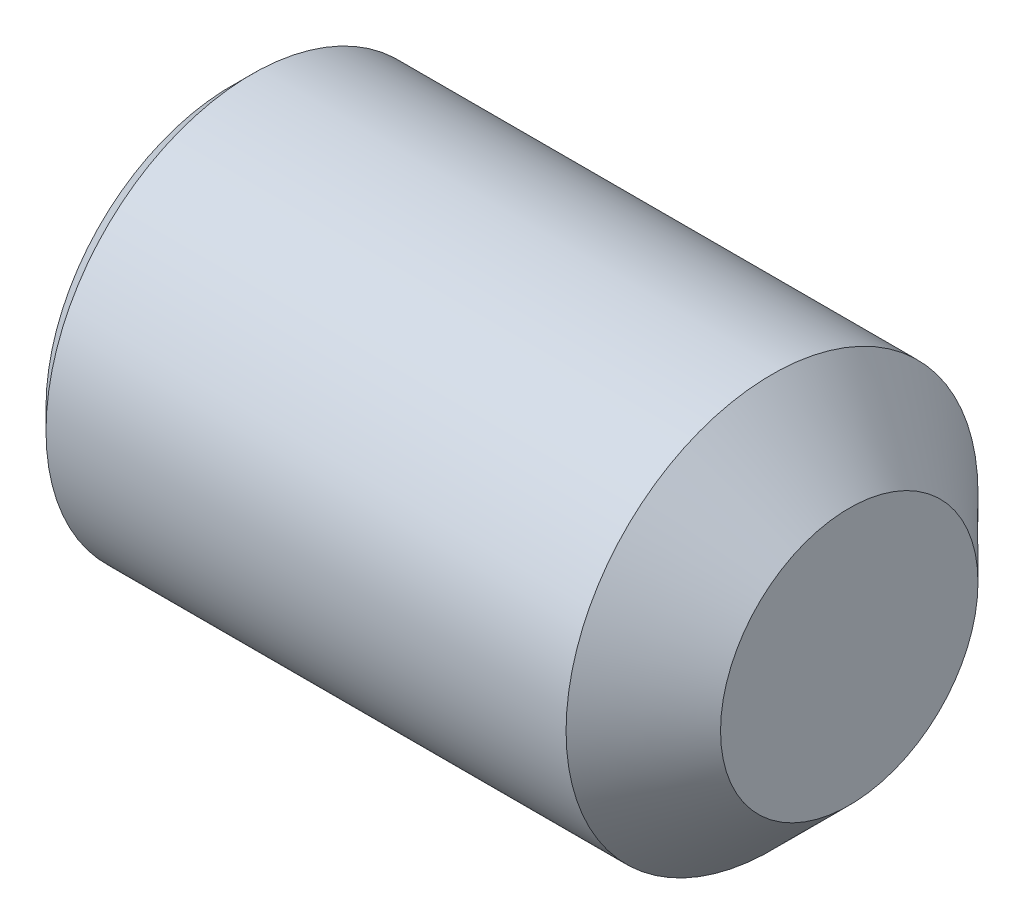
ISO-10303-21;
HEADER;
FILE_DESCRIPTION(('STEP AP214'),'2;1');
FILE_NAME('part.step','',(''),(''),'','','');
FILE_SCHEMA(('AUTOMOTIVE_DESIGN { 1 0 10303 214 1 1 1 1 }'));
ENDSEC;
DATA;
#1=APPLICATION_CONTEXT('core data for automotive mechanical design processes');
#2=APPLICATION_PROTOCOL_DEFINITION('international standard','automotive_design',2000,#1);
#3=PRODUCT_CONTEXT('',#1,'mechanical');
#4=PRODUCT('Part','Part','',(#3));
#5=PRODUCT_RELATED_PRODUCT_CATEGORY('part','',(#4));
#6=PRODUCT_DEFINITION_FORMATION('','',#4);
#7=PRODUCT_DEFINITION_CONTEXT('part definition',#1,'design');
#8=PRODUCT_DEFINITION('design','',#6,#7);
#9=PRODUCT_DEFINITION_SHAPE('','',#8);
#10=(LENGTH_UNIT() NAMED_UNIT(*) SI_UNIT(.MILLI.,.METRE.));
#11=(NAMED_UNIT(*) PLANE_ANGLE_UNIT() SI_UNIT($,.RADIAN.));
#12=(NAMED_UNIT(*) SI_UNIT($,.STERADIAN.) SOLID_ANGLE_UNIT());
#13=UNCERTAINTY_MEASURE_WITH_UNIT(LENGTH_MEASURE(1.E-05),#10,'distance_accuracy_value','');
#14=(GEOMETRIC_REPRESENTATION_CONTEXT(3) GLOBAL_UNCERTAINTY_ASSIGNED_CONTEXT((#13)) GLOBAL_UNIT_ASSIGNED_CONTEXT((#10,
#11,#12)) REPRESENTATION_CONTEXT('',''));
#15=CARTESIAN_POINT('',(0.,0.,0.));
#16=DIRECTION('',(0.,0.,1.));
#17=DIRECTION('',(1.,0.,0.));
#18=AXIS2_PLACEMENT_3D('',#15,#16,#17);
#19=CARTESIAN_POINT('',(6.,0.,0.));
#20=DIRECTION('',(-1.,0.,0.));
#21=DIRECTION('',(0.,0.,1.));
#22=AXIS2_PLACEMENT_3D('',#19,#20,#21);
#23=CYLINDRICAL_SURFACE('',#22,2.);
#24=CARTESIAN_POINT('',(0.200000000000001,0.,0.));
#25=DIRECTION('',(-1.,0.,0.));
#26=DIRECTION('',(0.,0.,1.));
#27=AXIS2_PLACEMENT_3D('',#24,#25,#26);
#28=CIRCLE('',#27,2.);
#29=CARTESIAN_POINT('',(0.200000000000001,0.,2.));
#30=VERTEX_POINT('',#29);
#31=EDGE_CURVE('E11',#30,#30,#28,.F.);
#32=ORIENTED_EDGE('',*,*,#31,.T.);
#33=EDGE_LOOP('',(#32));
#34=FACE_BOUND('',#33,.T.);
#35=CARTESIAN_POINT('',(5.25000000000001,0.,0.));
#36=DIRECTION('',(1.,0.,0.));
#37=DIRECTION('',(0.,0.,-1.));
#38=AXIS2_PLACEMENT_3D('',#35,#36,#37);
#39=CIRCLE('',#38,2.);
#40=CARTESIAN_POINT('',(5.25000000000001,0.,2.));
#41=VERTEX_POINT('',#40);
#42=EDGE_CURVE('E148',#41,#41,#39,.F.);
#43=ORIENTED_EDGE('',*,*,#42,.T.);
#44=EDGE_LOOP('',(#43));
#45=FACE_BOUND('',#44,.T.);
#46=ADVANCED_FACE('F45',(#34,#45),#23,.T.);
#47=CARTESIAN_POINT('',(6.,2.,0.));
#48=DIRECTION('',(1.,0.,0.));
#49=DIRECTION('',(0.,0.,-1.));
#50=AXIS2_PLACEMENT_3D('',#47,#48,#49);
#51=PLANE('',#50);
#52=CARTESIAN_POINT('',(6.,0.,0.));
#53=DIRECTION('',(1.,0.,0.));
#54=DIRECTION('',(0.,0.,-1.));
#55=AXIS2_PLACEMENT_3D('',#52,#53,#54);
#56=CIRCLE('',#55,1.25);
#57=CARTESIAN_POINT('',(6.,0.,1.25));
#58=VERTEX_POINT('',#57);
#59=EDGE_CURVE('E156',#58,#58,#56,.T.);
#60=ORIENTED_EDGE('',*,*,#59,.T.);
#61=EDGE_LOOP('',(#60));
#62=FACE_BOUND('',#61,.T.);
#63=ADVANCED_FACE('F173',(#62),#51,.T.);
#64=CARTESIAN_POINT('',(0.,0.,0.));
#65=DIRECTION('',(-1.,0.,0.));
#66=DIRECTION('',(0.,0.,1.));
#67=AXIS2_PLACEMENT_3D('',#64,#65,#66);
#68=PLANE('',#67);
#69=CARTESIAN_POINT('',(0.,0.,0.));
#70=DIRECTION('',(-1.,0.,0.));
#71=DIRECTION('',(0.,0.,1.));
#72=AXIS2_PLACEMENT_3D('',#69,#70,#71);
#73=CIRCLE('',#72,1.8);
#74=CARTESIAN_POINT('',(0.,0.,1.8));
#75=VERTEX_POINT('',#74);
#76=EDGE_CURVE('E54',#75,#75,#73,.T.);
#77=ORIENTED_EDGE('',*,*,#76,.T.);
#78=EDGE_LOOP('',(#77));
#79=FACE_BOUND('',#78,.T.);
#80=DIRECTION('',(0.,0.,1.));
#81=VECTOR('',#80,1.);
#82=CARTESIAN_POINT('',(0.,-1.,-0.577350269189628));
#83=LINE('',#82,#81);
#84=CARTESIAN_POINT('',(0.,-1.,-0.577350269189628));
#85=VERTEX_POINT('',#84);
#86=CARTESIAN_POINT('',(0.,-1.,0.577350269189623));
#87=VERTEX_POINT('',#86);
#88=EDGE_CURVE('E61',#85,#87,#83,.T.);
#89=ORIENTED_EDGE('',*,*,#88,.F.);
#90=DIRECTION('',(0.,-0.866025403784441,0.499999999999996));
#91=VECTOR('',#90,1.);
#92=CARTESIAN_POINT('',(0.,0.,-1.15470053837925));
#93=LINE('',#92,#91);
#94=CARTESIAN_POINT('',(0.,0.,-1.15470053837925));
#95=VERTEX_POINT('',#94);
#96=EDGE_CURVE('E144',#95,#85,#93,.T.);
#97=ORIENTED_EDGE('',*,*,#96,.F.);
#98=DIRECTION('',(0.,-0.86602540378444,-0.499999999999998));
#99=VECTOR('',#98,1.);
#100=CARTESIAN_POINT('',(0.,1.,-0.577350269189629));
#101=LINE('',#100,#99);
#102=CARTESIAN_POINT('',(0.,1.,-0.577350269189629));
#103=VERTEX_POINT('',#102);
#104=EDGE_CURVE('E142',#103,#95,#101,.T.);
#105=ORIENTED_EDGE('',*,*,#104,.F.);
#106=DIRECTION('',(0.,0.,-1.));
#107=VECTOR('',#106,1.);
#108=CARTESIAN_POINT('',(0.,1.,0.577350269189622));
#109=LINE('',#108,#107);
#110=CARTESIAN_POINT('',(0.,1.,0.577350269189622));
#111=VERTEX_POINT('',#110);
#112=EDGE_CURVE('E109',#111,#103,#109,.T.);
#113=ORIENTED_EDGE('',*,*,#112,.F.);
#114=DIRECTION('',(0.,0.866025403784438,-0.500000000000002));
#115=VECTOR('',#114,1.);
#116=CARTESIAN_POINT('',(0.,0.,1.15470053837925));
#117=LINE('',#116,#115);
#118=CARTESIAN_POINT('',(0.,0.,1.15470053837925));
#119=VERTEX_POINT('',#118);
#120=EDGE_CURVE('E138',#119,#111,#117,.T.);
#121=ORIENTED_EDGE('',*,*,#120,.F.);
#122=DIRECTION('',(0.,0.86602540378444,0.499999999999998));
#123=VECTOR('',#122,1.);
#124=CARTESIAN_POINT('',(0.,-1.,0.577350269189623));
#125=LINE('',#124,#123);
#126=EDGE_CURVE('E135',#87,#119,#125,.T.);
#127=ORIENTED_EDGE('',*,*,#126,.F.);
#128=EDGE_LOOP('',(#89,#97,#105,#113,#121,#127));
#129=FACE_BOUND('',#128,.T.);
#130=ADVANCED_FACE('F161',(#79,#129),#68,.T.);
#131=CARTESIAN_POINT('',(2.3,-1.,-0.577350269189628));
#132=DIRECTION('',(0.,-1.,0.));
#133=DIRECTION('',(0.,0.,-1.));
#134=AXIS2_PLACEMENT_3D('',#131,#132,#133);
#135=PLANE('',#134);
#136=ORIENTED_EDGE('',*,*,#88,.T.);
#137=DIRECTION('',(-1.,0.,0.));
#138=VECTOR('',#137,1.);
#139=CARTESIAN_POINT('',(2.3,-1.,0.577350269189623));
#140=LINE('',#139,#138);
#141=CARTESIAN_POINT('',(2.3,-1.,0.577350269189623));
#142=VERTEX_POINT('',#141);
#143=EDGE_CURVE('E91',#142,#87,#140,.T.);
#144=ORIENTED_EDGE('',*,*,#143,.F.);
#145=DIRECTION('',(0.,0.,1.));
#146=VECTOR('',#145,1.);
#147=CARTESIAN_POINT('',(2.3,-1.,-0.577350269189628));
#148=LINE('',#147,#146);
#149=CARTESIAN_POINT('',(2.3,-1.,-0.577350269189628));
#150=VERTEX_POINT('',#149);
#151=EDGE_CURVE('E146',#150,#142,#148,.T.);
#152=ORIENTED_EDGE('',*,*,#151,.F.);
#153=DIRECTION('',(-1.,0.,0.));
#154=VECTOR('',#153,1.);
#155=CARTESIAN_POINT('',(2.3,-1.,-0.577350269189628));
#156=LINE('',#155,#154);
#157=EDGE_CURVE('E69',#150,#85,#156,.T.);
#158=ORIENTED_EDGE('',*,*,#157,.T.);
#159=EDGE_LOOP('',(#136,#144,#152,#158));
#160=FACE_BOUND('',#159,.T.);
#161=ADVANCED_FACE('F190',(#160),#135,.F.);
#162=CARTESIAN_POINT('',(2.3,0.,-1.15470053837925));
#163=DIRECTION('',(0.,-0.499999999999996,-0.866025403784441));
#164=DIRECTION('',(0.,0.866025403784441,-0.499999999999996));
#165=AXIS2_PLACEMENT_3D('',#162,#163,#164);
#166=PLANE('',#165);
#167=ORIENTED_EDGE('',*,*,#96,.T.);
#168=ORIENTED_EDGE('',*,*,#157,.F.);
#169=DIRECTION('',(0.,-0.866025403784441,0.499999999999996));
#170=VECTOR('',#169,1.);
#171=CARTESIAN_POINT('',(2.3,0.,-1.15470053837925));
#172=LINE('',#171,#170);
#173=CARTESIAN_POINT('',(2.3,0.,-1.15470053837925));
#174=VERTEX_POINT('',#173);
#175=EDGE_CURVE('E121',#174,#150,#172,.T.);
#176=ORIENTED_EDGE('',*,*,#175,.F.);
#177=DIRECTION('',(-1.,0.,0.));
#178=VECTOR('',#177,1.);
#179=CARTESIAN_POINT('',(2.3,0.,-1.15470053837925));
#180=LINE('',#179,#178);
#181=EDGE_CURVE('E113',#174,#95,#180,.T.);
#182=ORIENTED_EDGE('',*,*,#181,.T.);
#183=EDGE_LOOP('',(#167,#168,#176,#182));
#184=FACE_BOUND('',#183,.T.);
#185=ADVANCED_FACE('F193',(#184),#166,.F.);
#186=CARTESIAN_POINT('',(2.3,1.,-0.577350269189629));
#187=DIRECTION('',(0.,0.499999999999998,-0.86602540378444));
#188=DIRECTION('',(0.,0.86602540378444,0.499999999999998));
#189=AXIS2_PLACEMENT_3D('',#186,#187,#188);
#190=PLANE('',#189);
#191=ORIENTED_EDGE('',*,*,#104,.T.);
#192=ORIENTED_EDGE('',*,*,#181,.F.);
#193=DIRECTION('',(0.,-0.86602540378444,-0.499999999999998));
#194=VECTOR('',#193,1.);
#195=CARTESIAN_POINT('',(2.3,1.,-0.577350269189629));
#196=LINE('',#195,#194);
#197=CARTESIAN_POINT('',(2.3,1.,-0.577350269189629));
#198=VERTEX_POINT('',#197);
#199=EDGE_CURVE('E117',#198,#174,#196,.T.);
#200=ORIENTED_EDGE('',*,*,#199,.F.);
#201=DIRECTION('',(-1.,0.,0.));
#202=VECTOR('',#201,1.);
#203=CARTESIAN_POINT('',(2.3,1.,-0.577350269189629));
#204=LINE('',#203,#202);
#205=EDGE_CURVE('E102',#198,#103,#204,.T.);
#206=ORIENTED_EDGE('',*,*,#205,.T.);
#207=EDGE_LOOP('',(#191,#192,#200,#206));
#208=FACE_BOUND('',#207,.T.);
#209=ADVANCED_FACE('F118',(#208),#190,.F.);
#210=CARTESIAN_POINT('',(2.3,1.,0.577350269189622));
#211=DIRECTION('',(0.,1.,0.));
#212=DIRECTION('',(0.,0.,1.));
#213=AXIS2_PLACEMENT_3D('',#210,#211,#212);
#214=PLANE('',#213);
#215=ORIENTED_EDGE('',*,*,#112,.T.);
#216=ORIENTED_EDGE('',*,*,#205,.F.);
#217=DIRECTION('',(0.,0.,-1.));
#218=VECTOR('',#217,1.);
#219=CARTESIAN_POINT('',(2.3,1.,0.577350269189622));
#220=LINE('',#219,#218);
#221=CARTESIAN_POINT('',(2.3,1.,0.577350269189622));
#222=VERTEX_POINT('',#221);
#223=EDGE_CURVE('E106',#222,#198,#220,.T.);
#224=ORIENTED_EDGE('',*,*,#223,.F.);
#225=DIRECTION('',(-1.,0.,0.));
#226=VECTOR('',#225,1.);
#227=CARTESIAN_POINT('',(2.3,1.,0.577350269189622));
#228=LINE('',#227,#226);
#229=EDGE_CURVE('E114',#222,#111,#228,.T.);
#230=ORIENTED_EDGE('',*,*,#229,.T.);
#231=EDGE_LOOP('',(#215,#216,#224,#230));
#232=FACE_BOUND('',#231,.T.);
#233=ADVANCED_FACE('F104',(#232),#214,.F.);
#234=CARTESIAN_POINT('',(2.3,0.,1.15470053837925));
#235=DIRECTION('',(0.,0.500000000000002,0.866025403784438));
#236=DIRECTION('',(0.,-0.866025403784438,0.500000000000002));
#237=AXIS2_PLACEMENT_3D('',#234,#235,#236);
#238=PLANE('',#237);
#239=ORIENTED_EDGE('',*,*,#120,.T.);
#240=ORIENTED_EDGE('',*,*,#229,.F.);
#241=DIRECTION('',(0.,0.866025403784438,-0.500000000000002));
#242=VECTOR('',#241,1.);
#243=CARTESIAN_POINT('',(2.3,0.,1.15470053837925));
#244=LINE('',#243,#242);
#245=CARTESIAN_POINT('',(2.3,0.,1.15470053837925));
#246=VERTEX_POINT('',#245);
#247=EDGE_CURVE('E127',#246,#222,#244,.T.);
#248=ORIENTED_EDGE('',*,*,#247,.F.);
#249=DIRECTION('',(-1.,0.,0.));
#250=VECTOR('',#249,1.);
#251=CARTESIAN_POINT('',(2.3,0.,1.15470053837925));
#252=LINE('',#251,#250);
#253=EDGE_CURVE('E151',#246,#119,#252,.T.);
#254=ORIENTED_EDGE('',*,*,#253,.T.);
#255=EDGE_LOOP('',(#239,#240,#248,#254));
#256=FACE_BOUND('',#255,.T.);
#257=ADVANCED_FACE('F197',(#256),#238,.F.);
#258=CARTESIAN_POINT('',(2.3,-1.,0.577350269189623));
#259=DIRECTION('',(0.,-0.499999999999998,0.86602540378444));
#260=DIRECTION('',(0.,-0.86602540378444,-0.499999999999998));
#261=AXIS2_PLACEMENT_3D('',#258,#259,#260);
#262=PLANE('',#261);
#263=ORIENTED_EDGE('',*,*,#126,.T.);
#264=ORIENTED_EDGE('',*,*,#253,.F.);
#265=DIRECTION('',(0.,0.86602540378444,0.499999999999998));
#266=VECTOR('',#265,1.);
#267=CARTESIAN_POINT('',(2.3,-1.,0.577350269189623));
#268=LINE('',#267,#266);
#269=EDGE_CURVE('E129',#142,#246,#268,.T.);
#270=ORIENTED_EDGE('',*,*,#269,.F.);
#271=ORIENTED_EDGE('',*,*,#143,.T.);
#272=EDGE_LOOP('',(#263,#264,#270,#271));
#273=FACE_BOUND('',#272,.T.);
#274=ADVANCED_FACE('F194',(#273),#262,.F.);
#275=CARTESIAN_POINT('',(2.3,0.,0.));
#276=DIRECTION('',(-1.,0.,0.));
#277=DIRECTION('',(0.,0.,1.));
#278=AXIS2_PLACEMENT_3D('',#275,#276,#277);
#279=PLANE('',#278);
#280=ORIENTED_EDGE('',*,*,#151,.T.);
#281=ORIENTED_EDGE('',*,*,#269,.T.);
#282=ORIENTED_EDGE('',*,*,#247,.T.);
#283=ORIENTED_EDGE('',*,*,#223,.T.);
#284=ORIENTED_EDGE('',*,*,#199,.T.);
#285=ORIENTED_EDGE('',*,*,#175,.T.);
#286=EDGE_LOOP('',(#280,#281,#282,#283,#284,#285));
#287=FACE_BOUND('',#286,.T.);
#288=ADVANCED_FACE('F124',(#287),#279,.T.);
#289=CARTESIAN_POINT('',(5.25000000000001,0.,0.));
#290=DIRECTION('',(-1.,0.,0.));
#291=DIRECTION('',(0.,0.,1.));
#292=AXIS2_PLACEMENT_3D('',#289,#290,#291);
#293=CONICAL_SURFACE('',#292,2.,0.785398163397456);
#294=CARTESIAN_POINT('',(6.,0.,1.25));
#295=CARTESIAN_POINT('',(5.9921875,0.,1.2578125));
#296=CARTESIAN_POINT('',(5.984375,0.,1.265625));
#297=CARTESIAN_POINT('',(5.96875,0.,1.28125));
#298=CARTESIAN_POINT('',(5.9609375,0.,1.2890625));
#299=CARTESIAN_POINT('',(5.9453125,0.,1.3046875));
#300=CARTESIAN_POINT('',(5.9375,0.,1.3125));
#301=CARTESIAN_POINT('',(5.921875,0.,1.328125));
#302=CARTESIAN_POINT('',(5.9140625,0.,1.3359375));
#303=CARTESIAN_POINT('',(5.8984375,0.,1.3515625));
#304=CARTESIAN_POINT('',(5.890625,0.,1.359375));
#305=CARTESIAN_POINT('',(5.875,0.,1.375));
#306=CARTESIAN_POINT('',(5.8671875,0.,1.3828125));
#307=CARTESIAN_POINT('',(5.8515625,0.,1.3984375));
#308=CARTESIAN_POINT('',(5.84375,0.,1.40625));
#309=CARTESIAN_POINT('',(5.828125,0.,1.421875));
#310=CARTESIAN_POINT('',(5.8203125,0.,1.4296875));
#311=CARTESIAN_POINT('',(5.8046875,0.,1.4453125));
#312=CARTESIAN_POINT('',(5.796875,0.,1.453125));
#313=CARTESIAN_POINT('',(5.78125,0.,1.46875));
#314=CARTESIAN_POINT('',(5.7734375,0.,1.4765625));
#315=CARTESIAN_POINT('',(5.7578125,0.,1.4921875));
#316=CARTESIAN_POINT('',(5.75,0.,1.5));
#317=CARTESIAN_POINT('',(5.734375,0.,1.515625));
#318=CARTESIAN_POINT('',(5.7265625,0.,1.5234375));
#319=CARTESIAN_POINT('',(5.7109375,0.,1.5390625));
#320=CARTESIAN_POINT('',(5.703125,0.,1.546875));
#321=CARTESIAN_POINT('',(5.6875,0.,1.5625));
#322=CARTESIAN_POINT('',(5.6796875,0.,1.5703125));
#323=CARTESIAN_POINT('',(5.6640625,0.,1.5859375));
#324=CARTESIAN_POINT('',(5.65625,0.,1.59375));
#325=CARTESIAN_POINT('',(5.640625,0.,1.609375));
#326=CARTESIAN_POINT('',(5.6328125,0.,1.6171875));
#327=CARTESIAN_POINT('',(5.6171875,0.,1.6328125));
#328=CARTESIAN_POINT('',(5.609375,0.,1.640625));
#329=CARTESIAN_POINT('',(5.59375,0.,1.65625));
#330=CARTESIAN_POINT('',(5.5859375,0.,1.6640625));
#331=CARTESIAN_POINT('',(5.5703125,0.,1.6796875));
#332=CARTESIAN_POINT('',(5.5625,0.,1.6875));
#333=CARTESIAN_POINT('',(5.546875,0.,1.703125));
#334=CARTESIAN_POINT('',(5.5390625,0.,1.7109375));
#335=CARTESIAN_POINT('',(5.5234375,0.,1.7265625));
#336=CARTESIAN_POINT('',(5.515625,0.,1.734375));
#337=CARTESIAN_POINT('',(5.5,0.,1.75));
#338=CARTESIAN_POINT('',(5.4921875,0.,1.7578125));
#339=CARTESIAN_POINT('',(5.4765625,0.,1.7734375));
#340=CARTESIAN_POINT('',(5.46875,0.,1.78125));
#341=CARTESIAN_POINT('',(5.453125,0.,1.796875));
#342=CARTESIAN_POINT('',(5.4453125,0.,1.8046875));
#343=CARTESIAN_POINT('',(5.4296875,0.,1.8203125));
#344=CARTESIAN_POINT('',(5.421875,0.,1.828125));
#345=CARTESIAN_POINT('',(5.40625,0.,1.84375));
#346=CARTESIAN_POINT('',(5.3984375,0.,1.8515625));
#347=CARTESIAN_POINT('',(5.3828125,0.,1.8671875));
#348=CARTESIAN_POINT('',(5.375,0.,1.875));
#349=CARTESIAN_POINT('',(5.359375,0.,1.890625));
#350=CARTESIAN_POINT('',(5.3515625,0.,1.8984375));
#351=CARTESIAN_POINT('',(5.3359375,0.,1.9140625));
#352=CARTESIAN_POINT('',(5.32812500000001,0.,1.921875));
#353=CARTESIAN_POINT('',(5.31250000000001,0.,1.9375));
#354=CARTESIAN_POINT('',(5.30468750000001,0.,1.9453125));
#355=CARTESIAN_POINT('',(5.28906250000001,0.,1.9609375));
#356=CARTESIAN_POINT('',(5.28125000000001,0.,1.96875));
#357=CARTESIAN_POINT('',(5.26562500000001,0.,1.984375));
#358=CARTESIAN_POINT('',(5.25781250000001,0.,1.9921875));
#359=CARTESIAN_POINT('',(5.25000000000001,0.,2.));
#360=B_SPLINE_CURVE_WITH_KNOTS('',3,(#294,#295,#296,#297,#298,#299,#300,#301,#302,#303,#304,
#305,#306,#307,#308,#309,#310,#311,#312,#313,#314,#315,#316,#317,#318,#319,#320,#321,#322,#323,
#324,#325,#326,#327,#328,#329,#330,#331,#332,#333,#334,#335,#336,#337,#338,#339,#340,#341,#342,
#343,#344,#345,#346,#347,#348,#349,#350,#351,#352,#353,#354,#355,#356,#357,#358,#359),
.UNSPECIFIED.,.F.,.F.,(4,2,2,2,2,2,2,2,2,2,2,2,2,2,2,2,2,2,2,2,2,2,2,2,2,2,2,2,2,2,2,2,4),(0.,
0.0331456303681188,0.0662912607362384,0.099436891104358,0.132582521472477,0.165728151840596,
0.198873782208716,0.232019412576835,0.265165042944955,0.298310673313074,0.331456303681193,
0.364601934049313,0.397747564417433,0.430893194785552,0.464038825153671,0.497184455521791,
0.53033008588991,0.563475716258029,0.596621346626149,0.629766976994268,0.662912607362388,
0.696058237730507,0.729203868098626,0.762349498466746,0.795495128834865,0.828640759202984,
0.861786389571104,0.894932019939223,0.928077650307343,0.961223280675462,0.994368911043581,
1.0275145414117,1.06066017177982),.UNSPECIFIED.);
#361=EDGE_CURVE('BSEAM165',#58,#41,#360,.T.);
#362=ORIENTED_EDGE('',*,*,#59,.F.);
#363=ORIENTED_EDGE('',*,*,#42,.F.);
#364=ORIENTED_EDGE('',*,*,#361,.T.);
#365=ORIENTED_EDGE('',*,*,#361,.F.);
#366=EDGE_LOOP('',(#362,#364,#363,#365));
#367=FACE_BOUND('',#366,.T.);
#368=ADVANCED_FACE('F165',(#367),#293,.T.);
#369=CARTESIAN_POINT('',(0.,0.,0.));
#370=DIRECTION('',(1.,0.,0.));
#371=DIRECTION('',(0.,0.,-1.));
#372=AXIS2_PLACEMENT_3D('',#369,#370,#371);
#373=CONICAL_SURFACE('',#372,1.8,0.78539816339745);
#374=ORIENTED_EDGE('',*,*,#31,.F.);
#375=EDGE_LOOP('',(#374));
#376=FACE_BOUND('',#375,.T.);
#377=ORIENTED_EDGE('',*,*,#76,.F.);
#378=EDGE_LOOP('',(#377));
#379=FACE_BOUND('',#378,.T.);
#380=ADVANCED_FACE('F48',(#376,#379),#373,.T.);
#381=CLOSED_SHELL('',(#46,#63,#130,#161,#185,#209,#233,#257,#274,#288,#368,#380));
#382=MANIFOLD_SOLID_BREP('B2',#381);
#383=ADVANCED_BREP_SHAPE_REPRESENTATION('',(#18,#382),#14);
#384=SHAPE_DEFINITION_REPRESENTATION(#9,#383);
ENDSEC;
END-ISO-10303-21;
